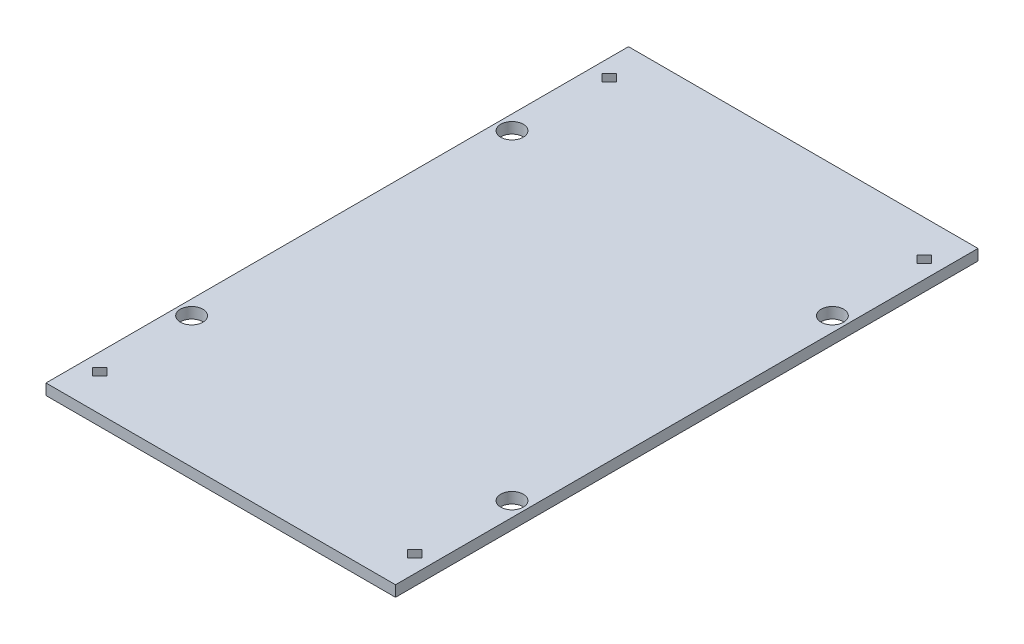
ISO-10303-21;
HEADER;
FILE_DESCRIPTION(('STEP AP214'),'2;1');
FILE_NAME('part.step','',(''),(''),'','','');
FILE_SCHEMA(('AUTOMOTIVE_DESIGN { 1 0 10303 214 1 1 1 1 }'));
ENDSEC;
DATA;
#1=APPLICATION_CONTEXT('core data for automotive mechanical design processes');
#2=APPLICATION_PROTOCOL_DEFINITION('international standard','automotive_design',2000,#1);
#3=PRODUCT_CONTEXT('',#1,'mechanical');
#4=PRODUCT('Part','Part','',(#3));
#5=PRODUCT_RELATED_PRODUCT_CATEGORY('part','',(#4));
#6=PRODUCT_DEFINITION_FORMATION('','',#4);
#7=PRODUCT_DEFINITION_CONTEXT('part definition',#1,'design');
#8=PRODUCT_DEFINITION('design','',#6,#7);
#9=PRODUCT_DEFINITION_SHAPE('','',#8);
#10=(LENGTH_UNIT() NAMED_UNIT(*) SI_UNIT(.MILLI.,.METRE.));
#11=(NAMED_UNIT(*) PLANE_ANGLE_UNIT() SI_UNIT($,.RADIAN.));
#12=(NAMED_UNIT(*) SI_UNIT($,.STERADIAN.) SOLID_ANGLE_UNIT());
#13=UNCERTAINTY_MEASURE_WITH_UNIT(LENGTH_MEASURE(1.E-05),#10,'distance_accuracy_value','');
#14=(GEOMETRIC_REPRESENTATION_CONTEXT(3) GLOBAL_UNCERTAINTY_ASSIGNED_CONTEXT((#13)) GLOBAL_UNIT_ASSIGNED_CONTEXT((#10,
#11,#12)) REPRESENTATION_CONTEXT('',''));
#15=CARTESIAN_POINT('',(0.,0.,0.));
#16=DIRECTION('',(0.,0.,1.));
#17=DIRECTION('',(1.,0.,0.));
#18=AXIS2_PLACEMENT_3D('',#15,#16,#17);
#19=CARTESIAN_POINT('',(0.,1.5,0.));
#20=DIRECTION('',(0.,1.,0.));
#21=DIRECTION('',(0.,0.,1.));
#22=AXIS2_PLACEMENT_3D('',#19,#20,#21);
#23=PLANE('',#22);
#24=CARTESIAN_POINT('',(22.,1.5,22.));
#25=DIRECTION('',(0.,1.,0.));
#26=DIRECTION('',(0.,0.,1.));
#27=AXIS2_PLACEMENT_3D('',#24,#25,#26);
#28=CIRCLE('',#27,1.55);
#29=CARTESIAN_POINT('',(22.,1.5,23.55));
#30=VERTEX_POINT('',#29);
#31=EDGE_CURVE('E590',#30,#30,#28,.T.);
#32=ORIENTED_EDGE('',*,*,#31,.F.);
#33=EDGE_LOOP('',(#32));
#34=FACE_BOUND('',#33,.T.);
#35=CARTESIAN_POINT('',(-22.,1.5,-22.));
#36=DIRECTION('',(0.,1.,0.));
#37=DIRECTION('',(0.,0.,1.));
#38=AXIS2_PLACEMENT_3D('',#35,#36,#37);
#39=CIRCLE('',#38,1.55);
#40=CARTESIAN_POINT('',(-22.,1.5,-20.45));
#41=VERTEX_POINT('',#40);
#42=EDGE_CURVE('E207',#41,#41,#39,.T.);
#43=ORIENTED_EDGE('',*,*,#42,.F.);
#44=EDGE_LOOP('',(#43));
#45=FACE_BOUND('',#44,.T.);
#46=DIRECTION('',(0.,0.,-1.));
#47=VECTOR('',#46,1.);
#48=CARTESIAN_POINT('',(24.,1.5,-40.));
#49=LINE('',#48,#47);
#50=CARTESIAN_POINT('',(24.,1.5,40.));
#51=VERTEX_POINT('',#50);
#52=CARTESIAN_POINT('',(24.,1.5,-40.));
#53=VERTEX_POINT('',#52);
#54=EDGE_CURVE('E310',#51,#53,#49,.T.);
#55=ORIENTED_EDGE('',*,*,#54,.T.);
#56=DIRECTION('',(-1.,0.,0.));
#57=VECTOR('',#56,1.);
#58=CARTESIAN_POINT('',(-24.,1.5,-40.));
#59=LINE('',#58,#57);
#60=CARTESIAN_POINT('',(-24.,1.5,-40.));
#61=VERTEX_POINT('',#60);
#62=EDGE_CURVE('E313',#53,#61,#59,.T.);
#63=ORIENTED_EDGE('',*,*,#62,.T.);
#64=DIRECTION('',(0.,0.,1.));
#65=VECTOR('',#64,1.);
#66=CARTESIAN_POINT('',(-24.,1.5,-40.));
#67=LINE('',#66,#65);
#68=CARTESIAN_POINT('',(-24.,1.5,40.));
#69=VERTEX_POINT('',#68);
#70=EDGE_CURVE('E316',#61,#69,#67,.T.);
#71=ORIENTED_EDGE('',*,*,#70,.T.);
#72=DIRECTION('',(1.,0.,0.));
#73=VECTOR('',#72,1.);
#74=CARTESIAN_POINT('',(-24.,1.5,40.));
#75=LINE('',#74,#73);
#76=EDGE_CURVE('E318',#69,#51,#75,.T.);
#77=ORIENTED_EDGE('',*,*,#76,.T.);
#78=EDGE_LOOP('',(#55,#63,#71,#77));
#79=FACE_BOUND('',#78,.T.);
#80=DIRECTION('',(-0.707106781186549,0.,0.707106781186546));
#81=VECTOR('',#80,1.);
#82=CARTESIAN_POINT('',(20.62,1.5,-35.));
#83=LINE('',#82,#81);
#84=CARTESIAN_POINT('',(21.62,1.5,-36.));
#85=VERTEX_POINT('',#84);
#86=CARTESIAN_POINT('',(20.62,1.5,-35.));
#87=VERTEX_POINT('',#86);
#88=EDGE_CURVE('E281',#85,#87,#83,.T.);
#89=ORIENTED_EDGE('',*,*,#88,.F.);
#90=DIRECTION('',(-0.707106781186549,0.,-0.707106781186546));
#91=VECTOR('',#90,1.);
#92=CARTESIAN_POINT('',(21.62,1.5,-36.));
#93=LINE('',#92,#91);
#94=CARTESIAN_POINT('',(22.62,1.5,-35.));
#95=VERTEX_POINT('',#94);
#96=EDGE_CURVE('E279',#95,#85,#93,.T.);
#97=ORIENTED_EDGE('',*,*,#96,.F.);
#98=DIRECTION('',(0.707106781186549,0.,-0.707106781186546));
#99=VECTOR('',#98,1.);
#100=CARTESIAN_POINT('',(22.62,1.5,-35.));
#101=LINE('',#100,#99);
#102=CARTESIAN_POINT('',(21.62,1.5,-34.));
#103=VERTEX_POINT('',#102);
#104=EDGE_CURVE('E287',#103,#95,#101,.T.);
#105=ORIENTED_EDGE('',*,*,#104,.F.);
#106=DIRECTION('',(0.707106781186549,0.,0.707106781186546));
#107=VECTOR('',#106,1.);
#108=CARTESIAN_POINT('',(21.62,1.5,-34.));
#109=LINE('',#108,#107);
#110=EDGE_CURVE('E284',#87,#103,#109,.T.);
#111=ORIENTED_EDGE('',*,*,#110,.F.);
#112=EDGE_LOOP('',(#89,#97,#105,#111));
#113=FACE_BOUND('',#112,.T.);
#114=DIRECTION('',(0.707106781186549,0.,-0.707106781186546));
#115=VECTOR('',#114,1.);
#116=CARTESIAN_POINT('',(-21.62,1.5,-34.));
#117=LINE('',#116,#115);
#118=CARTESIAN_POINT('',(-21.62,1.5,-34.));
#119=VERTEX_POINT('',#118);
#120=CARTESIAN_POINT('',(-20.62,1.5,-35.));
#121=VERTEX_POINT('',#120);
#122=EDGE_CURVE('E250',#119,#121,#117,.T.);
#123=ORIENTED_EDGE('',*,*,#122,.F.);
#124=DIRECTION('',(0.707106781186549,0.,0.707106781186546));
#125=VECTOR('',#124,1.);
#126=CARTESIAN_POINT('',(-22.62,1.5,-35.));
#127=LINE('',#126,#125);
#128=CARTESIAN_POINT('',(-22.62,1.5,-35.));
#129=VERTEX_POINT('',#128);
#130=EDGE_CURVE('E248',#129,#119,#127,.T.);
#131=ORIENTED_EDGE('',*,*,#130,.F.);
#132=DIRECTION('',(-0.707106781186549,0.,0.707106781186546));
#133=VECTOR('',#132,1.);
#134=CARTESIAN_POINT('',(-21.62,1.5,-36.));
#135=LINE('',#134,#133);
#136=CARTESIAN_POINT('',(-21.62,1.5,-36.));
#137=VERTEX_POINT('',#136);
#138=EDGE_CURVE('E256',#137,#129,#135,.T.);
#139=ORIENTED_EDGE('',*,*,#138,.F.);
#140=DIRECTION('',(-0.707106781186549,0.,-0.707106781186546));
#141=VECTOR('',#140,1.);
#142=CARTESIAN_POINT('',(-20.62,1.5,-35.));
#143=LINE('',#142,#141);
#144=EDGE_CURVE('E253',#121,#137,#143,.T.);
#145=ORIENTED_EDGE('',*,*,#144,.F.);
#146=EDGE_LOOP('',(#123,#131,#139,#145));
#147=FACE_BOUND('',#146,.T.);
#148=DIRECTION('',(0.707106781186549,0.,-0.707106781186546));
#149=VECTOR('',#148,1.);
#150=CARTESIAN_POINT('',(21.62,1.5,36.));
#151=LINE('',#150,#149);
#152=CARTESIAN_POINT('',(21.62,1.5,36.));
#153=VERTEX_POINT('',#152);
#154=CARTESIAN_POINT('',(22.62,1.5,35.));
#155=VERTEX_POINT('',#154);
#156=EDGE_CURVE('E219',#153,#155,#151,.T.);
#157=ORIENTED_EDGE('',*,*,#156,.F.);
#158=DIRECTION('',(0.707106781186549,0.,0.707106781186546));
#159=VECTOR('',#158,1.);
#160=CARTESIAN_POINT('',(20.62,1.5,35.));
#161=LINE('',#160,#159);
#162=CARTESIAN_POINT('',(20.62,1.5,35.));
#163=VERTEX_POINT('',#162);
#164=EDGE_CURVE('E217',#163,#153,#161,.T.);
#165=ORIENTED_EDGE('',*,*,#164,.F.);
#166=DIRECTION('',(-0.707106781186549,0.,0.707106781186546));
#167=VECTOR('',#166,1.);
#168=CARTESIAN_POINT('',(21.62,1.5,34.));
#169=LINE('',#168,#167);
#170=CARTESIAN_POINT('',(21.62,1.5,34.));
#171=VERTEX_POINT('',#170);
#172=EDGE_CURVE('E225',#171,#163,#169,.T.);
#173=ORIENTED_EDGE('',*,*,#172,.F.);
#174=DIRECTION('',(-0.707106781186549,0.,-0.707106781186546));
#175=VECTOR('',#174,1.);
#176=CARTESIAN_POINT('',(22.62,1.5,35.));
#177=LINE('',#176,#175);
#178=EDGE_CURVE('E222',#155,#171,#177,.T.);
#179=ORIENTED_EDGE('',*,*,#178,.F.);
#180=EDGE_LOOP('',(#157,#165,#173,#179));
#181=FACE_BOUND('',#180,.T.);
#182=DIRECTION('',(0.707106781186549,0.,-0.707106781186546));
#183=VECTOR('',#182,1.);
#184=CARTESIAN_POINT('',(-20.62,1.5,35.));
#185=LINE('',#184,#183);
#186=CARTESIAN_POINT('',(-21.62,1.5,36.));
#187=VERTEX_POINT('',#186);
#188=CARTESIAN_POINT('',(-20.62,1.5,35.));
#189=VERTEX_POINT('',#188);
#190=EDGE_CURVE('E186',#187,#189,#185,.T.);
#191=ORIENTED_EDGE('',*,*,#190,.F.);
#192=DIRECTION('',(0.707106781186549,0.,0.707106781186546));
#193=VECTOR('',#192,1.);
#194=CARTESIAN_POINT('',(-21.62,1.5,36.));
#195=LINE('',#194,#193);
#196=CARTESIAN_POINT('',(-22.62,1.5,35.));
#197=VERTEX_POINT('',#196);
#198=EDGE_CURVE('E178',#197,#187,#195,.T.);
#199=ORIENTED_EDGE('',*,*,#198,.F.);
#200=DIRECTION('',(-0.707106781186549,0.,0.707106781186546));
#201=VECTOR('',#200,1.);
#202=CARTESIAN_POINT('',(-22.62,1.5,35.));
#203=LINE('',#202,#201);
#204=CARTESIAN_POINT('',(-21.62,1.5,34.));
#205=VERTEX_POINT('',#204);
#206=EDGE_CURVE('E201',#205,#197,#203,.T.);
#207=ORIENTED_EDGE('',*,*,#206,.F.);
#208=DIRECTION('',(-0.707106781186549,0.,-0.707106781186546));
#209=VECTOR('',#208,1.);
#210=CARTESIAN_POINT('',(-21.62,1.5,34.));
#211=LINE('',#210,#209);
#212=EDGE_CURVE('E199',#189,#205,#211,.T.);
#213=ORIENTED_EDGE('',*,*,#212,.F.);
#214=EDGE_LOOP('',(#191,#199,#207,#213));
#215=FACE_BOUND('',#214,.T.);
#216=CARTESIAN_POINT('',(22.,1.5,-22.));
#217=DIRECTION('',(0.,1.,0.));
#218=DIRECTION('',(0.,0.,-1.));
#219=AXIS2_PLACEMENT_3D('',#216,#217,#218);
#220=CIRCLE('',#219,1.55);
#221=CARTESIAN_POINT('',(22.,1.5,-23.55));
#222=VERTEX_POINT('',#221);
#223=EDGE_CURVE('E596',#222,#222,#220,.T.);
#224=ORIENTED_EDGE('',*,*,#223,.F.);
#225=EDGE_LOOP('',(#224));
#226=FACE_BOUND('',#225,.T.);
#227=CARTESIAN_POINT('',(-22.,1.5,22.));
#228=DIRECTION('',(0.,1.,0.));
#229=DIRECTION('',(0.,0.,-1.));
#230=AXIS2_PLACEMENT_3D('',#227,#228,#229);
#231=CIRCLE('',#230,1.55);
#232=CARTESIAN_POINT('',(-22.,1.5,20.45));
#233=VERTEX_POINT('',#232);
#234=EDGE_CURVE('E581',#233,#233,#231,.T.);
#235=ORIENTED_EDGE('',*,*,#234,.F.);
#236=EDGE_LOOP('',(#235));
#237=FACE_BOUND('',#236,.T.);
#238=ADVANCED_FACE('F41',(#34,#45,#79,#113,#147,#181,#215,#226,#237),#23,.T.);
#239=CARTESIAN_POINT('',(0.,0.,0.));
#240=DIRECTION('',(0.,1.,0.));
#241=DIRECTION('',(0.,0.,1.));
#242=AXIS2_PLACEMENT_3D('',#239,#240,#241);
#243=PLANE('',#242);
#244=DIRECTION('',(0.707106781186549,0.,0.707106781186546));
#245=VECTOR('',#244,1.);
#246=CARTESIAN_POINT('',(20.62,0.,35.));
#247=LINE('',#246,#245);
#248=CARTESIAN_POINT('',(20.62,0.,35.));
#249=VERTEX_POINT('',#248);
#250=CARTESIAN_POINT('',(21.62,0.,36.));
#251=VERTEX_POINT('',#250);
#252=EDGE_CURVE('E194',#249,#251,#247,.T.);
#253=ORIENTED_EDGE('',*,*,#252,.T.);
#254=DIRECTION('',(0.707106781186549,0.,-0.707106781186546));
#255=VECTOR('',#254,1.);
#256=CARTESIAN_POINT('',(21.62,0.,36.));
#257=LINE('',#256,#255);
#258=CARTESIAN_POINT('',(22.62,0.,35.));
#259=VERTEX_POINT('',#258);
#260=EDGE_CURVE('E230',#251,#259,#257,.T.);
#261=ORIENTED_EDGE('',*,*,#260,.T.);
#262=DIRECTION('',(-0.707106781186549,0.,-0.707106781186546));
#263=VECTOR('',#262,1.);
#264=CARTESIAN_POINT('',(22.62,0.,35.));
#265=LINE('',#264,#263);
#266=CARTESIAN_POINT('',(21.62,0.,34.));
#267=VERTEX_POINT('',#266);
#268=EDGE_CURVE('E233',#259,#267,#265,.T.);
#269=ORIENTED_EDGE('',*,*,#268,.T.);
#270=DIRECTION('',(-0.707106781186549,0.,0.707106781186546));
#271=VECTOR('',#270,1.);
#272=CARTESIAN_POINT('',(21.62,0.,34.));
#273=LINE('',#272,#271);
#274=EDGE_CURVE('E220',#267,#249,#273,.T.);
#275=ORIENTED_EDGE('',*,*,#274,.T.);
#276=EDGE_LOOP('',(#253,#261,#269,#275));
#277=FACE_BOUND('',#276,.T.);
#278=DIRECTION('',(-0.707106781186549,0.,-0.707106781186546));
#279=VECTOR('',#278,1.);
#280=CARTESIAN_POINT('',(21.62,0.,-36.));
#281=LINE('',#280,#279);
#282=CARTESIAN_POINT('',(22.62,0.,-35.));
#283=VERTEX_POINT('',#282);
#284=CARTESIAN_POINT('',(21.62,0.,-36.));
#285=VERTEX_POINT('',#284);
#286=EDGE_CURVE('E278',#283,#285,#281,.T.);
#287=ORIENTED_EDGE('',*,*,#286,.T.);
#288=DIRECTION('',(-0.707106781186549,0.,0.707106781186546));
#289=VECTOR('',#288,1.);
#290=CARTESIAN_POINT('',(20.62,0.,-35.));
#291=LINE('',#290,#289);
#292=CARTESIAN_POINT('',(20.62,0.,-35.));
#293=VERTEX_POINT('',#292);
#294=EDGE_CURVE('E292',#285,#293,#291,.T.);
#295=ORIENTED_EDGE('',*,*,#294,.T.);
#296=DIRECTION('',(0.707106781186549,0.,0.707106781186546));
#297=VECTOR('',#296,1.);
#298=CARTESIAN_POINT('',(21.62,0.,-34.));
#299=LINE('',#298,#297);
#300=CARTESIAN_POINT('',(21.62,0.,-34.));
#301=VERTEX_POINT('',#300);
#302=EDGE_CURVE('E295',#293,#301,#299,.T.);
#303=ORIENTED_EDGE('',*,*,#302,.T.);
#304=DIRECTION('',(0.707106781186549,0.,-0.707106781186546));
#305=VECTOR('',#304,1.);
#306=CARTESIAN_POINT('',(22.62,0.,-35.));
#307=LINE('',#306,#305);
#308=EDGE_CURVE('E282',#301,#283,#307,.T.);
#309=ORIENTED_EDGE('',*,*,#308,.T.);
#310=EDGE_LOOP('',(#287,#295,#303,#309));
#311=FACE_BOUND('',#310,.T.);
#312=DIRECTION('',(0.,0.,-1.));
#313=VECTOR('',#312,1.);
#314=CARTESIAN_POINT('',(24.,0.,-40.));
#315=LINE('',#314,#313);
#316=CARTESIAN_POINT('',(24.,0.,40.));
#317=VERTEX_POINT('',#316);
#318=CARTESIAN_POINT('',(24.,0.,-40.));
#319=VERTEX_POINT('',#318);
#320=EDGE_CURVE('E309',#317,#319,#315,.T.);
#321=ORIENTED_EDGE('',*,*,#320,.F.);
#322=DIRECTION('',(1.,0.,0.));
#323=VECTOR('',#322,1.);
#324=CARTESIAN_POINT('',(-24.,0.,40.));
#325=LINE('',#324,#323);
#326=CARTESIAN_POINT('',(-24.,0.,40.));
#327=VERTEX_POINT('',#326);
#328=EDGE_CURVE('E314',#327,#317,#325,.T.);
#329=ORIENTED_EDGE('',*,*,#328,.F.);
#330=DIRECTION('',(0.,0.,1.));
#331=VECTOR('',#330,1.);
#332=CARTESIAN_POINT('',(-24.,0.,-40.));
#333=LINE('',#332,#331);
#334=CARTESIAN_POINT('',(-24.,0.,-40.));
#335=VERTEX_POINT('',#334);
#336=EDGE_CURVE('E325',#335,#327,#333,.T.);
#337=ORIENTED_EDGE('',*,*,#336,.F.);
#338=DIRECTION('',(-1.,0.,0.));
#339=VECTOR('',#338,1.);
#340=CARTESIAN_POINT('',(-24.,0.,-40.));
#341=LINE('',#340,#339);
#342=EDGE_CURVE('E323',#319,#335,#341,.T.);
#343=ORIENTED_EDGE('',*,*,#342,.F.);
#344=EDGE_LOOP('',(#321,#329,#337,#343));
#345=FACE_BOUND('',#344,.T.);
#346=DIRECTION('',(0.707106781186549,0.,0.707106781186546));
#347=VECTOR('',#346,1.);
#348=CARTESIAN_POINT('',(-22.62,0.,-35.));
#349=LINE('',#348,#347);
#350=CARTESIAN_POINT('',(-22.62,0.,-35.));
#351=VERTEX_POINT('',#350);
#352=CARTESIAN_POINT('',(-21.62,0.,-34.));
#353=VERTEX_POINT('',#352);
#354=EDGE_CURVE('E247',#351,#353,#349,.T.);
#355=ORIENTED_EDGE('',*,*,#354,.T.);
#356=DIRECTION('',(0.707106781186549,0.,-0.707106781186546));
#357=VECTOR('',#356,1.);
#358=CARTESIAN_POINT('',(-21.62,0.,-34.));
#359=LINE('',#358,#357);
#360=CARTESIAN_POINT('',(-20.62,0.,-35.));
#361=VERTEX_POINT('',#360);
#362=EDGE_CURVE('E261',#353,#361,#359,.T.);
#363=ORIENTED_EDGE('',*,*,#362,.T.);
#364=DIRECTION('',(-0.707106781186549,0.,-0.707106781186546));
#365=VECTOR('',#364,1.);
#366=CARTESIAN_POINT('',(-20.62,0.,-35.));
#367=LINE('',#366,#365);
#368=CARTESIAN_POINT('',(-21.62,0.,-36.));
#369=VERTEX_POINT('',#368);
#370=EDGE_CURVE('E264',#361,#369,#367,.T.);
#371=ORIENTED_EDGE('',*,*,#370,.T.);
#372=DIRECTION('',(-0.707106781186549,0.,0.707106781186546));
#373=VECTOR('',#372,1.);
#374=CARTESIAN_POINT('',(-21.62,0.,-36.));
#375=LINE('',#374,#373);
#376=EDGE_CURVE('E251',#369,#351,#375,.T.);
#377=ORIENTED_EDGE('',*,*,#376,.T.);
#378=EDGE_LOOP('',(#355,#363,#371,#377));
#379=FACE_BOUND('',#378,.T.);
#380=DIRECTION('',(0.707106781186549,0.,0.707106781186546));
#381=VECTOR('',#380,1.);
#382=CARTESIAN_POINT('',(-21.62,0.,36.));
#383=LINE('',#382,#381);
#384=CARTESIAN_POINT('',(-22.62,0.,35.));
#385=VERTEX_POINT('',#384);
#386=CARTESIAN_POINT('',(-21.62,0.,36.));
#387=VERTEX_POINT('',#386);
#388=EDGE_CURVE('E64',#385,#387,#383,.T.);
#389=ORIENTED_EDGE('',*,*,#388,.T.);
#390=DIRECTION('',(0.707106781186549,0.,-0.707106781186546));
#391=VECTOR('',#390,1.);
#392=CARTESIAN_POINT('',(-20.62,0.,35.));
#393=LINE('',#392,#391);
#394=CARTESIAN_POINT('',(-20.62,0.,35.));
#395=VERTEX_POINT('',#394);
#396=EDGE_CURVE('E193',#387,#395,#393,.T.);
#397=ORIENTED_EDGE('',*,*,#396,.T.);
#398=DIRECTION('',(-0.707106781186549,0.,-0.707106781186546));
#399=VECTOR('',#398,1.);
#400=CARTESIAN_POINT('',(-21.62,0.,34.));
#401=LINE('',#400,#399);
#402=CARTESIAN_POINT('',(-21.62,0.,34.));
#403=VERTEX_POINT('',#402);
#404=EDGE_CURVE('E209',#395,#403,#401,.T.);
#405=ORIENTED_EDGE('',*,*,#404,.T.);
#406=DIRECTION('',(-0.707106781186549,0.,0.707106781186546));
#407=VECTOR('',#406,1.);
#408=CARTESIAN_POINT('',(-22.62,0.,35.));
#409=LINE('',#408,#407);
#410=EDGE_CURVE('E187',#403,#385,#409,.T.);
#411=ORIENTED_EDGE('',*,*,#410,.T.);
#412=EDGE_LOOP('',(#389,#397,#405,#411));
#413=FACE_BOUND('',#412,.T.);
#414=CARTESIAN_POINT('',(-22.,0.,-22.));
#415=DIRECTION('',(0.,1.,0.));
#416=DIRECTION('',(0.,0.,1.));
#417=AXIS2_PLACEMENT_3D('',#414,#415,#416);
#418=CIRCLE('',#417,1.55);
#419=CARTESIAN_POINT('',(-22.,0.,-20.45));
#420=VERTEX_POINT('',#419);
#421=EDGE_CURVE('E599',#420,#420,#418,.T.);
#422=ORIENTED_EDGE('',*,*,#421,.T.);
#423=EDGE_LOOP('',(#422));
#424=FACE_BOUND('',#423,.T.);
#425=CARTESIAN_POINT('',(22.,0.,-22.));
#426=DIRECTION('',(0.,1.,0.));
#427=DIRECTION('',(0.,0.,-1.));
#428=AXIS2_PLACEMENT_3D('',#425,#426,#427);
#429=CIRCLE('',#428,1.55);
#430=CARTESIAN_POINT('',(22.,0.,-23.55));
#431=VERTEX_POINT('',#430);
#432=EDGE_CURVE('E593',#431,#431,#429,.T.);
#433=ORIENTED_EDGE('',*,*,#432,.T.);
#434=EDGE_LOOP('',(#433));
#435=FACE_BOUND('',#434,.T.);
#436=CARTESIAN_POINT('',(22.,0.,22.));
#437=DIRECTION('',(0.,1.,0.));
#438=DIRECTION('',(0.,0.,1.));
#439=AXIS2_PLACEMENT_3D('',#436,#437,#438);
#440=CIRCLE('',#439,1.55);
#441=CARTESIAN_POINT('',(22.,0.,23.55));
#442=VERTEX_POINT('',#441);
#443=EDGE_CURVE('E587',#442,#442,#440,.T.);
#444=ORIENTED_EDGE('',*,*,#443,.T.);
#445=EDGE_LOOP('',(#444));
#446=FACE_BOUND('',#445,.T.);
#447=CARTESIAN_POINT('',(-22.,0.,22.));
#448=DIRECTION('',(0.,1.,0.));
#449=DIRECTION('',(0.,0.,-1.));
#450=AXIS2_PLACEMENT_3D('',#447,#448,#449);
#451=CIRCLE('',#450,1.55);
#452=CARTESIAN_POINT('',(-22.,0.,20.45));
#453=VERTEX_POINT('',#452);
#454=EDGE_CURVE('E584',#453,#453,#451,.T.);
#455=ORIENTED_EDGE('',*,*,#454,.T.);
#456=EDGE_LOOP('',(#455));
#457=FACE_BOUND('',#456,.T.);
#458=ADVANCED_FACE('F343',(#277,#311,#345,#379,#413,#424,#435,#446,#457),#243,.F.);
#459=CARTESIAN_POINT('',(24.,1.5,-40.));
#460=DIRECTION('',(-1.,0.,0.));
#461=DIRECTION('',(0.,0.,1.));
#462=AXIS2_PLACEMENT_3D('',#459,#460,#461);
#463=PLANE('',#462);
#464=ORIENTED_EDGE('',*,*,#320,.T.);
#465=DIRECTION('',(0.,-1.,0.));
#466=VECTOR('',#465,1.);
#467=CARTESIAN_POINT('',(24.,1.5,-40.));
#468=LINE('',#467,#466);
#469=EDGE_CURVE('E11',#53,#319,#468,.T.);
#470=ORIENTED_EDGE('',*,*,#469,.F.);
#471=ORIENTED_EDGE('',*,*,#54,.F.);
#472=DIRECTION('',(0.,-1.,0.));
#473=VECTOR('',#472,1.);
#474=CARTESIAN_POINT('',(24.,1.5,40.));
#475=LINE('',#474,#473);
#476=EDGE_CURVE('E320',#51,#317,#475,.T.);
#477=ORIENTED_EDGE('',*,*,#476,.T.);
#478=EDGE_LOOP('',(#464,#470,#471,#477));
#479=FACE_BOUND('',#478,.T.);
#480=ADVANCED_FACE('F43',(#479),#463,.F.);
#481=CARTESIAN_POINT('',(-24.,1.5,-40.));
#482=DIRECTION('',(0.,0.,1.));
#483=DIRECTION('',(1.,0.,0.));
#484=AXIS2_PLACEMENT_3D('',#481,#482,#483);
#485=PLANE('',#484);
#486=ORIENTED_EDGE('',*,*,#342,.T.);
#487=DIRECTION('',(0.,-1.,0.));
#488=VECTOR('',#487,1.);
#489=CARTESIAN_POINT('',(-24.,1.5,-40.));
#490=LINE('',#489,#488);
#491=EDGE_CURVE('E49',#61,#335,#490,.T.);
#492=ORIENTED_EDGE('',*,*,#491,.F.);
#493=ORIENTED_EDGE('',*,*,#62,.F.);
#494=ORIENTED_EDGE('',*,*,#469,.T.);
#495=EDGE_LOOP('',(#486,#492,#493,#494));
#496=FACE_BOUND('',#495,.T.);
#497=ADVANCED_FACE('F354',(#496),#485,.F.);
#498=CARTESIAN_POINT('',(-24.,1.5,-40.));
#499=DIRECTION('',(1.,0.,0.));
#500=DIRECTION('',(0.,0.,-1.));
#501=AXIS2_PLACEMENT_3D('',#498,#499,#500);
#502=PLANE('',#501);
#503=ORIENTED_EDGE('',*,*,#336,.T.);
#504=DIRECTION('',(0.,-1.,0.));
#505=VECTOR('',#504,1.);
#506=CARTESIAN_POINT('',(-24.,1.5,40.));
#507=LINE('',#506,#505);
#508=EDGE_CURVE('E330',#69,#327,#507,.T.);
#509=ORIENTED_EDGE('',*,*,#508,.F.);
#510=ORIENTED_EDGE('',*,*,#70,.F.);
#511=ORIENTED_EDGE('',*,*,#491,.T.);
#512=EDGE_LOOP('',(#503,#509,#510,#511));
#513=FACE_BOUND('',#512,.T.);
#514=ADVANCED_FACE('F337',(#513),#502,.F.);
#515=CARTESIAN_POINT('',(-24.,1.5,40.));
#516=DIRECTION('',(0.,0.,-1.));
#517=DIRECTION('',(-1.,0.,0.));
#518=AXIS2_PLACEMENT_3D('',#515,#516,#517);
#519=PLANE('',#518);
#520=ORIENTED_EDGE('',*,*,#328,.T.);
#521=ORIENTED_EDGE('',*,*,#476,.F.);
#522=ORIENTED_EDGE('',*,*,#76,.F.);
#523=ORIENTED_EDGE('',*,*,#508,.T.);
#524=EDGE_LOOP('',(#520,#521,#522,#523));
#525=FACE_BOUND('',#524,.T.);
#526=ADVANCED_FACE('F347',(#525),#519,.F.);
#527=CARTESIAN_POINT('',(21.62,1.5,-36.));
#528=DIRECTION('',(-0.707106781186546,0.,0.707106781186549));
#529=DIRECTION('',(0.707106781186549,0.,0.707106781186546));
#530=AXIS2_PLACEMENT_3D('',#527,#528,#529);
#531=PLANE('',#530);
#532=ORIENTED_EDGE('',*,*,#286,.F.);
#533=DIRECTION('',(0.,-1.,0.));
#534=VECTOR('',#533,1.);
#535=CARTESIAN_POINT('',(22.62,1.5,-35.));
#536=LINE('',#535,#534);
#537=EDGE_CURVE('E289',#95,#283,#536,.T.);
#538=ORIENTED_EDGE('',*,*,#537,.F.);
#539=ORIENTED_EDGE('',*,*,#96,.T.);
#540=DIRECTION('',(0.,-1.,0.));
#541=VECTOR('',#540,1.);
#542=CARTESIAN_POINT('',(21.62,1.5,-36.));
#543=LINE('',#542,#541);
#544=EDGE_CURVE('E306',#85,#285,#543,.T.);
#545=ORIENTED_EDGE('',*,*,#544,.T.);
#546=EDGE_LOOP('',(#532,#538,#539,#545));
#547=FACE_BOUND('',#546,.T.);
#548=ADVANCED_FACE('F372',(#547),#531,.T.);
#549=CARTESIAN_POINT('',(20.62,1.5,-35.));
#550=DIRECTION('',(0.707106781186546,0.,0.707106781186549));
#551=DIRECTION('',(0.707106781186549,0.,-0.707106781186546));
#552=AXIS2_PLACEMENT_3D('',#549,#550,#551);
#553=PLANE('',#552);
#554=ORIENTED_EDGE('',*,*,#294,.F.);
#555=ORIENTED_EDGE('',*,*,#544,.F.);
#556=ORIENTED_EDGE('',*,*,#88,.T.);
#557=DIRECTION('',(0.,-1.,0.));
#558=VECTOR('',#557,1.);
#559=CARTESIAN_POINT('',(20.62,1.5,-35.));
#560=LINE('',#559,#558);
#561=EDGE_CURVE('E304',#87,#293,#560,.T.);
#562=ORIENTED_EDGE('',*,*,#561,.T.);
#563=EDGE_LOOP('',(#554,#555,#556,#562));
#564=FACE_BOUND('',#563,.T.);
#565=ADVANCED_FACE('F379',(#564),#553,.T.);
#566=CARTESIAN_POINT('',(21.62,1.5,-34.));
#567=DIRECTION('',(0.707106781186546,0.,-0.707106781186549));
#568=DIRECTION('',(-0.707106781186549,0.,-0.707106781186546));
#569=AXIS2_PLACEMENT_3D('',#566,#567,#568);
#570=PLANE('',#569);
#571=ORIENTED_EDGE('',*,*,#302,.F.);
#572=ORIENTED_EDGE('',*,*,#561,.F.);
#573=ORIENTED_EDGE('',*,*,#110,.T.);
#574=DIRECTION('',(0.,-1.,0.));
#575=VECTOR('',#574,1.);
#576=CARTESIAN_POINT('',(21.62,1.5,-34.));
#577=LINE('',#576,#575);
#578=EDGE_CURVE('E302',#103,#301,#577,.T.);
#579=ORIENTED_EDGE('',*,*,#578,.T.);
#580=EDGE_LOOP('',(#571,#572,#573,#579));
#581=FACE_BOUND('',#580,.T.);
#582=ADVANCED_FACE('F384',(#581),#570,.T.);
#583=CARTESIAN_POINT('',(22.62,1.5,-35.));
#584=DIRECTION('',(-0.707106781186546,0.,-0.707106781186549));
#585=DIRECTION('',(-0.707106781186549,0.,0.707106781186546));
#586=AXIS2_PLACEMENT_3D('',#583,#584,#585);
#587=PLANE('',#586);
#588=ORIENTED_EDGE('',*,*,#308,.F.);
#589=ORIENTED_EDGE('',*,*,#578,.F.);
#590=ORIENTED_EDGE('',*,*,#104,.T.);
#591=ORIENTED_EDGE('',*,*,#537,.T.);
#592=EDGE_LOOP('',(#588,#589,#590,#591));
#593=FACE_BOUND('',#592,.T.);
#594=ADVANCED_FACE('F392',(#593),#587,.T.);
#595=CARTESIAN_POINT('',(-22.62,1.5,-35.));
#596=DIRECTION('',(0.707106781186546,0.,-0.707106781186549));
#597=DIRECTION('',(-0.707106781186549,0.,-0.707106781186546));
#598=AXIS2_PLACEMENT_3D('',#595,#596,#597);
#599=PLANE('',#598);
#600=ORIENTED_EDGE('',*,*,#354,.F.);
#601=DIRECTION('',(0.,-1.,0.));
#602=VECTOR('',#601,1.);
#603=CARTESIAN_POINT('',(-22.62,1.5,-35.));
#604=LINE('',#603,#602);
#605=EDGE_CURVE('E258',#129,#351,#604,.T.);
#606=ORIENTED_EDGE('',*,*,#605,.F.);
#607=ORIENTED_EDGE('',*,*,#130,.T.);
#608=DIRECTION('',(0.,-1.,0.));
#609=VECTOR('',#608,1.);
#610=CARTESIAN_POINT('',(-21.62,1.5,-34.));
#611=LINE('',#610,#609);
#612=EDGE_CURVE('E275',#119,#353,#611,.T.);
#613=ORIENTED_EDGE('',*,*,#612,.T.);
#614=EDGE_LOOP('',(#600,#606,#607,#613));
#615=FACE_BOUND('',#614,.T.);
#616=ADVANCED_FACE('F446',(#615),#599,.T.);
#617=CARTESIAN_POINT('',(-21.62,1.5,-34.));
#618=DIRECTION('',(-0.707106781186546,0.,-0.707106781186549));
#619=DIRECTION('',(-0.707106781186549,0.,0.707106781186546));
#620=AXIS2_PLACEMENT_3D('',#617,#618,#619);
#621=PLANE('',#620);
#622=ORIENTED_EDGE('',*,*,#362,.F.);
#623=ORIENTED_EDGE('',*,*,#612,.F.);
#624=ORIENTED_EDGE('',*,*,#122,.T.);
#625=DIRECTION('',(0.,-1.,0.));
#626=VECTOR('',#625,1.);
#627=CARTESIAN_POINT('',(-20.62,1.5,-35.));
#628=LINE('',#627,#626);
#629=EDGE_CURVE('E273',#121,#361,#628,.T.);
#630=ORIENTED_EDGE('',*,*,#629,.T.);
#631=EDGE_LOOP('',(#622,#623,#624,#630));
#632=FACE_BOUND('',#631,.T.);
#633=ADVANCED_FACE('F442',(#632),#621,.T.);
#634=CARTESIAN_POINT('',(-20.62,1.5,-35.));
#635=DIRECTION('',(-0.707106781186546,0.,0.707106781186549));
#636=DIRECTION('',(0.707106781186549,0.,0.707106781186546));
#637=AXIS2_PLACEMENT_3D('',#634,#635,#636);
#638=PLANE('',#637);
#639=ORIENTED_EDGE('',*,*,#370,.F.);
#640=ORIENTED_EDGE('',*,*,#629,.F.);
#641=ORIENTED_EDGE('',*,*,#144,.T.);
#642=DIRECTION('',(0.,-1.,0.));
#643=VECTOR('',#642,1.);
#644=CARTESIAN_POINT('',(-21.62,1.5,-36.));
#645=LINE('',#644,#643);
#646=EDGE_CURVE('E271',#137,#369,#645,.T.);
#647=ORIENTED_EDGE('',*,*,#646,.T.);
#648=EDGE_LOOP('',(#639,#640,#641,#647));
#649=FACE_BOUND('',#648,.T.);
#650=ADVANCED_FACE('F438',(#649),#638,.T.);
#651=CARTESIAN_POINT('',(-21.62,1.5,-36.));
#652=DIRECTION('',(0.707106781186546,0.,0.707106781186549));
#653=DIRECTION('',(0.707106781186549,0.,-0.707106781186546));
#654=AXIS2_PLACEMENT_3D('',#651,#652,#653);
#655=PLANE('',#654);
#656=ORIENTED_EDGE('',*,*,#376,.F.);
#657=ORIENTED_EDGE('',*,*,#646,.F.);
#658=ORIENTED_EDGE('',*,*,#138,.T.);
#659=ORIENTED_EDGE('',*,*,#605,.T.);
#660=EDGE_LOOP('',(#656,#657,#658,#659));
#661=FACE_BOUND('',#660,.T.);
#662=ADVANCED_FACE('F435',(#661),#655,.T.);
#663=CARTESIAN_POINT('',(20.62,1.5,35.));
#664=DIRECTION('',(0.707106781186546,0.,-0.707106781186549));
#665=DIRECTION('',(-0.707106781186549,0.,-0.707106781186546));
#666=AXIS2_PLACEMENT_3D('',#663,#664,#665);
#667=PLANE('',#666);
#668=ORIENTED_EDGE('',*,*,#252,.F.);
#669=DIRECTION('',(0.,-1.,0.));
#670=VECTOR('',#669,1.);
#671=CARTESIAN_POINT('',(20.62,1.5,35.));
#672=LINE('',#671,#670);
#673=EDGE_CURVE('E227',#163,#249,#672,.T.);
#674=ORIENTED_EDGE('',*,*,#673,.F.);
#675=ORIENTED_EDGE('',*,*,#164,.T.);
#676=DIRECTION('',(0.,-1.,0.));
#677=VECTOR('',#676,1.);
#678=CARTESIAN_POINT('',(21.62,1.5,36.));
#679=LINE('',#678,#677);
#680=EDGE_CURVE('E244',#153,#251,#679,.T.);
#681=ORIENTED_EDGE('',*,*,#680,.T.);
#682=EDGE_LOOP('',(#668,#674,#675,#681));
#683=FACE_BOUND('',#682,.T.);
#684=ADVANCED_FACE('F417',(#683),#667,.T.);
#685=CARTESIAN_POINT('',(21.62,1.5,36.));
#686=DIRECTION('',(-0.707106781186546,0.,-0.707106781186549));
#687=DIRECTION('',(-0.707106781186549,0.,0.707106781186546));
#688=AXIS2_PLACEMENT_3D('',#685,#686,#687);
#689=PLANE('',#688);
#690=ORIENTED_EDGE('',*,*,#260,.F.);
#691=ORIENTED_EDGE('',*,*,#680,.F.);
#692=ORIENTED_EDGE('',*,*,#156,.T.);
#693=DIRECTION('',(0.,-1.,0.));
#694=VECTOR('',#693,1.);
#695=CARTESIAN_POINT('',(22.62,1.5,35.));
#696=LINE('',#695,#694);
#697=EDGE_CURVE('E242',#155,#259,#696,.T.);
#698=ORIENTED_EDGE('',*,*,#697,.T.);
#699=EDGE_LOOP('',(#690,#691,#692,#698));
#700=FACE_BOUND('',#699,.T.);
#701=ADVANCED_FACE('F411',(#700),#689,.T.);
#702=CARTESIAN_POINT('',(22.62,1.5,35.));
#703=DIRECTION('',(-0.707106781186546,0.,0.707106781186549));
#704=DIRECTION('',(0.707106781186549,0.,0.707106781186546));
#705=AXIS2_PLACEMENT_3D('',#702,#703,#704);
#706=PLANE('',#705);
#707=ORIENTED_EDGE('',*,*,#268,.F.);
#708=ORIENTED_EDGE('',*,*,#697,.F.);
#709=ORIENTED_EDGE('',*,*,#178,.T.);
#710=DIRECTION('',(0.,-1.,0.));
#711=VECTOR('',#710,1.);
#712=CARTESIAN_POINT('',(21.62,1.5,34.));
#713=LINE('',#712,#711);
#714=EDGE_CURVE('E240',#171,#267,#713,.T.);
#715=ORIENTED_EDGE('',*,*,#714,.T.);
#716=EDGE_LOOP('',(#707,#708,#709,#715));
#717=FACE_BOUND('',#716,.T.);
#718=ADVANCED_FACE('F414',(#717),#706,.T.);
#719=CARTESIAN_POINT('',(21.62,1.5,34.));
#720=DIRECTION('',(0.707106781186546,0.,0.707106781186549));
#721=DIRECTION('',(0.707106781186549,0.,-0.707106781186546));
#722=AXIS2_PLACEMENT_3D('',#719,#720,#721);
#723=PLANE('',#722);
#724=ORIENTED_EDGE('',*,*,#274,.F.);
#725=ORIENTED_EDGE('',*,*,#714,.F.);
#726=ORIENTED_EDGE('',*,*,#172,.T.);
#727=ORIENTED_EDGE('',*,*,#673,.T.);
#728=EDGE_LOOP('',(#724,#725,#726,#727));
#729=FACE_BOUND('',#728,.T.);
#730=ADVANCED_FACE('F420',(#729),#723,.T.);
#731=CARTESIAN_POINT('',(-21.62,1.5,36.));
#732=DIRECTION('',(0.707106781186546,0.,-0.707106781186549));
#733=DIRECTION('',(-0.707106781186549,0.,-0.707106781186546));
#734=AXIS2_PLACEMENT_3D('',#731,#732,#733);
#735=PLANE('',#734);
#736=ORIENTED_EDGE('',*,*,#388,.F.);
#737=DIRECTION('',(0.,-1.,0.));
#738=VECTOR('',#737,1.);
#739=CARTESIAN_POINT('',(-22.62,1.5,35.));
#740=LINE('',#739,#738);
#741=EDGE_CURVE('E182',#197,#385,#740,.T.);
#742=ORIENTED_EDGE('',*,*,#741,.F.);
#743=ORIENTED_EDGE('',*,*,#198,.T.);
#744=DIRECTION('',(0.,-1.,0.));
#745=VECTOR('',#744,1.);
#746=CARTESIAN_POINT('',(-21.62,1.5,36.));
#747=LINE('',#746,#745);
#748=EDGE_CURVE('E181',#187,#387,#747,.T.);
#749=ORIENTED_EDGE('',*,*,#748,.T.);
#750=EDGE_LOOP('',(#736,#742,#743,#749));
#751=FACE_BOUND('',#750,.T.);
#752=ADVANCED_FACE('F180',(#751),#735,.T.);
#753=CARTESIAN_POINT('',(-20.62,1.5,35.));
#754=DIRECTION('',(-0.707106781186546,0.,-0.707106781186549));
#755=DIRECTION('',(-0.707106781186549,0.,0.707106781186546));
#756=AXIS2_PLACEMENT_3D('',#753,#754,#755);
#757=PLANE('',#756);
#758=ORIENTED_EDGE('',*,*,#396,.F.);
#759=ORIENTED_EDGE('',*,*,#748,.F.);
#760=ORIENTED_EDGE('',*,*,#190,.T.);
#761=DIRECTION('',(0.,-1.,0.));
#762=VECTOR('',#761,1.);
#763=CARTESIAN_POINT('',(-20.62,1.5,35.));
#764=LINE('',#763,#762);
#765=EDGE_CURVE('E195',#189,#395,#764,.T.);
#766=ORIENTED_EDGE('',*,*,#765,.T.);
#767=EDGE_LOOP('',(#758,#759,#760,#766));
#768=FACE_BOUND('',#767,.T.);
#769=ADVANCED_FACE('F190',(#768),#757,.T.);
#770=CARTESIAN_POINT('',(-21.62,1.5,34.));
#771=DIRECTION('',(-0.707106781186546,0.,0.707106781186549));
#772=DIRECTION('',(0.707106781186549,0.,0.707106781186546));
#773=AXIS2_PLACEMENT_3D('',#770,#771,#772);
#774=PLANE('',#773);
#775=ORIENTED_EDGE('',*,*,#404,.F.);
#776=ORIENTED_EDGE('',*,*,#765,.F.);
#777=ORIENTED_EDGE('',*,*,#212,.T.);
#778=DIRECTION('',(0.,-1.,0.));
#779=VECTOR('',#778,1.);
#780=CARTESIAN_POINT('',(-21.62,1.5,34.));
#781=LINE('',#780,#779);
#782=EDGE_CURVE('E56',#205,#403,#781,.T.);
#783=ORIENTED_EDGE('',*,*,#782,.T.);
#784=EDGE_LOOP('',(#775,#776,#777,#783));
#785=FACE_BOUND('',#784,.T.);
#786=ADVANCED_FACE('F518',(#785),#774,.T.);
#787=CARTESIAN_POINT('',(-22.62,1.5,35.));
#788=DIRECTION('',(0.707106781186546,0.,0.707106781186549));
#789=DIRECTION('',(0.707106781186549,0.,-0.707106781186546));
#790=AXIS2_PLACEMENT_3D('',#787,#788,#789);
#791=PLANE('',#790);
#792=ORIENTED_EDGE('',*,*,#410,.F.);
#793=ORIENTED_EDGE('',*,*,#782,.F.);
#794=ORIENTED_EDGE('',*,*,#206,.T.);
#795=ORIENTED_EDGE('',*,*,#741,.T.);
#796=EDGE_LOOP('',(#792,#793,#794,#795));
#797=FACE_BOUND('',#796,.T.);
#798=ADVANCED_FACE('F526',(#797),#791,.T.);
#799=CARTESIAN_POINT('',(-22.,1.5,-22.));
#800=DIRECTION('',(0.,-1.,0.));
#801=DIRECTION('',(0.,0.,-1.));
#802=AXIS2_PLACEMENT_3D('',#799,#800,#801);
#803=CYLINDRICAL_SURFACE('',#802,1.55);
#804=ORIENTED_EDGE('',*,*,#42,.T.);
#805=EDGE_LOOP('',(#804));
#806=FACE_BOUND('',#805,.T.);
#807=ORIENTED_EDGE('',*,*,#421,.F.);
#808=EDGE_LOOP('',(#807));
#809=FACE_BOUND('',#808,.T.);
#810=ADVANCED_FACE('F536',(#806,#809),#803,.F.);
#811=CARTESIAN_POINT('',(22.,1.5,-22.));
#812=DIRECTION('',(0.,-1.,0.));
#813=DIRECTION('',(0.,0.,-1.));
#814=AXIS2_PLACEMENT_3D('',#811,#812,#813);
#815=CYLINDRICAL_SURFACE('',#814,1.55);
#816=ORIENTED_EDGE('',*,*,#223,.T.);
#817=EDGE_LOOP('',(#816));
#818=FACE_BOUND('',#817,.T.);
#819=ORIENTED_EDGE('',*,*,#432,.F.);
#820=EDGE_LOOP('',(#819));
#821=FACE_BOUND('',#820,.T.);
#822=ADVANCED_FACE('F545',(#818,#821),#815,.F.);
#823=CARTESIAN_POINT('',(22.,1.5,22.));
#824=DIRECTION('',(0.,-1.,0.));
#825=DIRECTION('',(0.,0.,-1.));
#826=AXIS2_PLACEMENT_3D('',#823,#824,#825);
#827=CYLINDRICAL_SURFACE('',#826,1.55);
#828=ORIENTED_EDGE('',*,*,#31,.T.);
#829=EDGE_LOOP('',(#828));
#830=FACE_BOUND('',#829,.T.);
#831=ORIENTED_EDGE('',*,*,#443,.F.);
#832=EDGE_LOOP('',(#831));
#833=FACE_BOUND('',#832,.T.);
#834=ADVANCED_FACE('F555',(#830,#833),#827,.F.);
#835=CARTESIAN_POINT('',(-22.,1.5,22.));
#836=DIRECTION('',(0.,-1.,0.));
#837=DIRECTION('',(0.,0.,-1.));
#838=AXIS2_PLACEMENT_3D('',#835,#836,#837);
#839=CYLINDRICAL_SURFACE('',#838,1.55);
#840=ORIENTED_EDGE('',*,*,#234,.T.);
#841=EDGE_LOOP('',(#840));
#842=FACE_BOUND('',#841,.T.);
#843=ORIENTED_EDGE('',*,*,#454,.F.);
#844=EDGE_LOOP('',(#843));
#845=FACE_BOUND('',#844,.T.);
#846=ADVANCED_FACE('F565',(#842,#845),#839,.F.);
#847=CLOSED_SHELL('',(#238,#458,#480,#497,#514,#526,#548,#565,#582,#594,#616,#633,#650,#662,
#684,#701,#718,#730,#752,#769,#786,#798,#810,#822,#834,#846));
#848=MANIFOLD_SOLID_BREP('B2',#847);
#849=ADVANCED_BREP_SHAPE_REPRESENTATION('',(#18,#848),#14);
#850=SHAPE_DEFINITION_REPRESENTATION(#9,#849);
ENDSEC;
END-ISO-10303-21;
